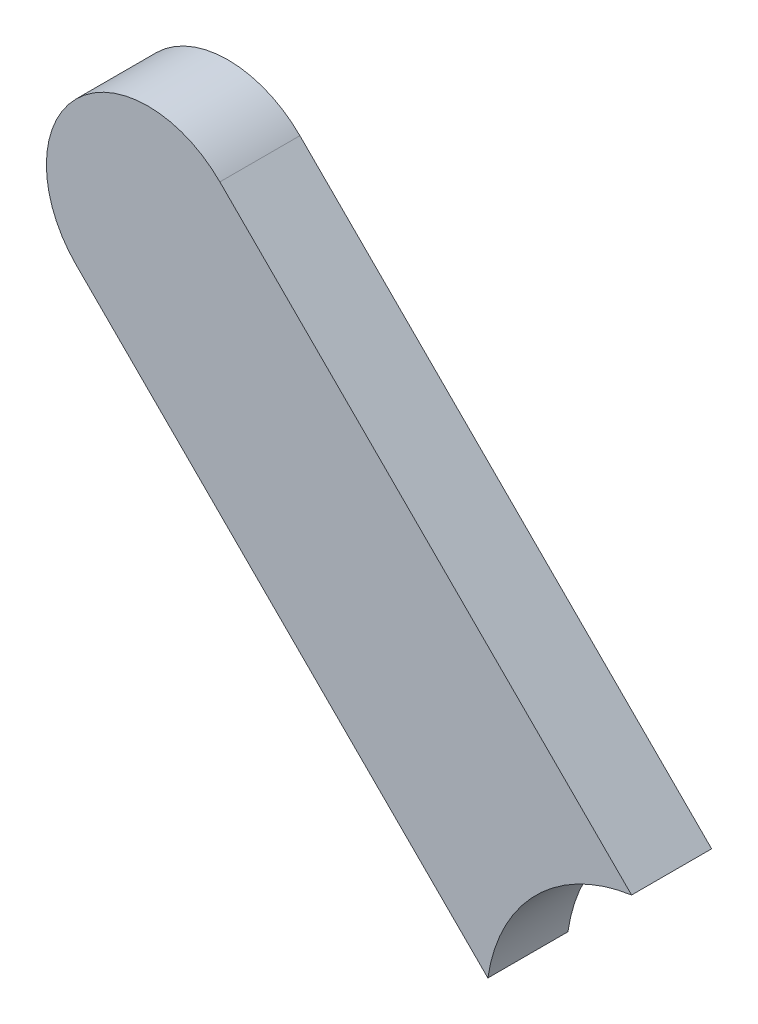
ISO-10303-21;
HEADER;
FILE_DESCRIPTION(('STEP AP214'),'2;1');
FILE_NAME('part.step','',(''),(''),'','','');
FILE_SCHEMA(('AUTOMOTIVE_DESIGN { 1 0 10303 214 1 1 1 1 }'));
ENDSEC;
DATA;
#1=APPLICATION_CONTEXT('core data for automotive mechanical design processes');
#2=APPLICATION_PROTOCOL_DEFINITION('international standard','automotive_design',2000,#1);
#3=PRODUCT_CONTEXT('',#1,'mechanical');
#4=PRODUCT('Part','Part','',(#3));
#5=PRODUCT_RELATED_PRODUCT_CATEGORY('part','',(#4));
#6=PRODUCT_DEFINITION_FORMATION('','',#4);
#7=PRODUCT_DEFINITION_CONTEXT('part definition',#1,'design');
#8=PRODUCT_DEFINITION('design','',#6,#7);
#9=PRODUCT_DEFINITION_SHAPE('','',#8);
#10=(LENGTH_UNIT() NAMED_UNIT(*) SI_UNIT(.MILLI.,.METRE.));
#11=(NAMED_UNIT(*) PLANE_ANGLE_UNIT() SI_UNIT($,.RADIAN.));
#12=(NAMED_UNIT(*) SI_UNIT($,.STERADIAN.) SOLID_ANGLE_UNIT());
#13=UNCERTAINTY_MEASURE_WITH_UNIT(LENGTH_MEASURE(1.E-05),#10,'distance_accuracy_value','');
#14=(GEOMETRIC_REPRESENTATION_CONTEXT(3) GLOBAL_UNCERTAINTY_ASSIGNED_CONTEXT((#13)) GLOBAL_UNIT_ASSIGNED_CONTEXT((#10,
#11,#12)) REPRESENTATION_CONTEXT('',''));
#15=CARTESIAN_POINT('',(0.,0.,0.));
#16=DIRECTION('',(0.,0.,1.));
#17=DIRECTION('',(1.,0.,0.));
#18=AXIS2_PLACEMENT_3D('',#15,#16,#17);
#19=CARTESIAN_POINT('',(148.9183966,116.15239406,0.));
#20=DIRECTION('',(0.707106781186548,0.707106781186548,0.));
#21=DIRECTION('',(0.707106781186548,-0.707106781186548,0.));
#22=AXIS2_PLACEMENT_3D('',#19,#20,#21);
#23=PLANE('',#22);
#24=DIRECTION('',(0.707106781186548,-0.707106781186548,0.));
#25=VECTOR('',#24,1.);
#26=CARTESIAN_POINT('',(148.9183966,116.15239406,0.1999996));
#27=LINE('',#26,#25);
#28=CARTESIAN_POINT('',(148.9183966,116.15239406,0.1999996));
#29=VERTEX_POINT('',#28);
#30=CARTESIAN_POINT('',(149.947449607867,115.123341052133,0.1999996));
#31=VERTEX_POINT('',#30);
#32=EDGE_CURVE('E11',#29,#31,#27,.T.);
#33=ORIENTED_EDGE('',*,*,#32,.F.);
#34=DIRECTION('',(0.,0.,1.));
#35=VECTOR('',#34,1.);
#36=CARTESIAN_POINT('',(148.9183966,116.15239406,0.));
#37=LINE('',#36,#35);
#38=CARTESIAN_POINT('',(148.9183966,116.15239406,0.));
#39=VERTEX_POINT('',#38);
#40=EDGE_CURVE('E24',#39,#29,#37,.T.);
#41=ORIENTED_EDGE('',*,*,#40,.F.);
#42=DIRECTION('',(0.707106781186548,-0.707106781186548,0.));
#43=VECTOR('',#42,1.);
#44=CARTESIAN_POINT('',(148.9183966,116.15239406,0.));
#45=LINE('',#44,#43);
#46=CARTESIAN_POINT('',(149.947449607867,115.123341052133,0.));
#47=VERTEX_POINT('',#46);
#48=EDGE_CURVE('E75',#39,#47,#45,.T.);
#49=ORIENTED_EDGE('',*,*,#48,.T.);
#50=DIRECTION('',(0.,0.,1.));
#51=VECTOR('',#50,1.);
#52=CARTESIAN_POINT('',(149.947449607867,115.123341052133,0.));
#53=LINE('',#52,#51);
#54=EDGE_CURVE('E37',#47,#31,#53,.T.);
#55=ORIENTED_EDGE('',*,*,#54,.T.);
#56=EDGE_LOOP('',(#33,#41,#49,#55));
#57=FACE_BOUND('',#56,.T.);
#58=ADVANCED_FACE('F17',(#57),#23,.F.);
#59=CARTESIAN_POINT('',(150.368,115.062,0.));
#60=DIRECTION('',(0.,0.,-1.));
#61=DIRECTION('',(1.,0.,0.));
#62=AXIS2_PLACEMENT_3D('',#59,#60,#61);
#63=CYLINDRICAL_SURFACE('',#62,0.42500042);
#64=DIRECTION('',(0.,0.,1.));
#65=VECTOR('',#64,1.);
#66=CARTESIAN_POINT('',(150.306658947867,115.482550392133,0.));
#67=LINE('',#66,#65);
#68=CARTESIAN_POINT('',(150.306658947867,115.482550392133,0.));
#69=VERTEX_POINT('',#68);
#70=CARTESIAN_POINT('',(150.306658947867,115.482550392133,0.1999996));
#71=VERTEX_POINT('',#70);
#72=EDGE_CURVE('E67',#69,#71,#67,.T.);
#73=ORIENTED_EDGE('',*,*,#72,.T.);
#74=CARTESIAN_POINT('',(150.368,115.062,0.1999996));
#75=DIRECTION('',(0.,0.,1.));
#76=DIRECTION('',(1.,0.,0.));
#77=AXIS2_PLACEMENT_3D('',#74,#75,#76);
#78=CIRCLE('',#77,0.42500042);
#79=EDGE_CURVE('E82',#71,#31,#78,.T.);
#80=ORIENTED_EDGE('',*,*,#79,.T.);
#81=ORIENTED_EDGE('',*,*,#54,.F.);
#82=CARTESIAN_POINT('',(150.368,115.062,0.));
#83=DIRECTION('',(0.,0.,1.));
#84=DIRECTION('',(1.,0.,0.));
#85=AXIS2_PLACEMENT_3D('',#82,#83,#84);
#86=CIRCLE('',#85,0.42500042);
#87=EDGE_CURVE('E80',#69,#47,#86,.T.);
#88=ORIENTED_EDGE('',*,*,#87,.F.);
#89=EDGE_LOOP('',(#73,#80,#81,#88));
#90=FACE_BOUND('',#89,.T.);
#91=ADVANCED_FACE('F88',(#90),#63,.F.);
#92=CARTESIAN_POINT('',(150.306658947867,115.482550392133,0.));
#93=DIRECTION('',(-0.707106781186556,-0.70710678118654,0.));
#94=DIRECTION('',(-0.70710678118654,0.707106781186556,0.));
#95=AXIS2_PLACEMENT_3D('',#92,#93,#94);
#96=PLANE('',#95);
#97=DIRECTION('',(-0.70710678118654,0.707106781186556,0.));
#98=VECTOR('',#97,1.);
#99=CARTESIAN_POINT('',(150.5476034,115.24160594,0.1999996));
#100=LINE('',#99,#98);
#101=CARTESIAN_POINT('',(149.27760594,116.5116034,0.1999996));
#102=VERTEX_POINT('',#101);
#103=EDGE_CURVE('E71',#71,#102,#100,.T.);
#104=ORIENTED_EDGE('',*,*,#103,.F.);
#105=ORIENTED_EDGE('',*,*,#72,.F.);
#106=DIRECTION('',(-0.70710678118654,0.707106781186556,0.));
#107=VECTOR('',#106,1.);
#108=CARTESIAN_POINT('',(150.5476034,115.24160594,0.));
#109=LINE('',#108,#107);
#110=CARTESIAN_POINT('',(149.27760594,116.5116034,0.));
#111=VERTEX_POINT('',#110);
#112=EDGE_CURVE('E63',#69,#111,#109,.T.);
#113=ORIENTED_EDGE('',*,*,#112,.T.);
#114=DIRECTION('',(0.,0.,1.));
#115=VECTOR('',#114,1.);
#116=CARTESIAN_POINT('',(149.27760594,116.5116034,0.));
#117=LINE('',#116,#115);
#118=EDGE_CURVE('E53',#111,#102,#117,.T.);
#119=ORIENTED_EDGE('',*,*,#118,.T.);
#120=EDGE_LOOP('',(#104,#105,#113,#119));
#121=FACE_BOUND('',#120,.T.);
#122=ADVANCED_FACE('F66',(#121),#96,.F.);
#123=CARTESIAN_POINT('',(149.09800127,116.33199873,0.));
#124=DIRECTION('',(0.,0.,-1.));
#125=DIRECTION('',(0.707106781186548,0.707106781186548,0.));
#126=AXIS2_PLACEMENT_3D('',#123,#124,#125);
#127=CYLINDRICAL_SURFACE('',#126,0.253999360179549);
#128=CARTESIAN_POINT('',(149.09800127,116.33199873,0.1999996));
#129=DIRECTION('',(0.,0.,1.));
#130=DIRECTION('',(0.707106781186548,0.707106781186548,0.));
#131=AXIS2_PLACEMENT_3D('',#128,#129,#130);
#132=CIRCLE('',#131,0.253999360179549);
#133=EDGE_CURVE('E59',#102,#29,#132,.T.);
#134=ORIENTED_EDGE('',*,*,#133,.F.);
#135=ORIENTED_EDGE('',*,*,#118,.F.);
#136=CARTESIAN_POINT('',(149.09800127,116.33199873,0.));
#137=DIRECTION('',(0.,0.,1.));
#138=DIRECTION('',(0.707106781186548,0.707106781186548,0.));
#139=AXIS2_PLACEMENT_3D('',#136,#137,#138);
#140=CIRCLE('',#139,0.253999360179549);
#141=EDGE_CURVE('E57',#111,#39,#140,.T.);
#142=ORIENTED_EDGE('',*,*,#141,.T.);
#143=ORIENTED_EDGE('',*,*,#40,.T.);
#144=EDGE_LOOP('',(#134,#135,#142,#143));
#145=FACE_BOUND('',#144,.T.);
#146=ADVANCED_FACE('F55',(#145),#127,.T.);
#147=CARTESIAN_POINT('',(148.9183966,116.15239406,0.));
#148=DIRECTION('',(0.,0.,-1.));
#149=DIRECTION('',(-1.,0.,0.));
#150=AXIS2_PLACEMENT_3D('',#147,#148,#149);
#151=PLANE('',#150);
#152=ORIENTED_EDGE('',*,*,#48,.F.);
#153=ORIENTED_EDGE('',*,*,#141,.F.);
#154=ORIENTED_EDGE('',*,*,#112,.F.);
#155=ORIENTED_EDGE('',*,*,#87,.T.);
#156=EDGE_LOOP('',(#152,#153,#154,#155));
#157=FACE_BOUND('',#156,.T.);
#158=ADVANCED_FACE('F74',(#157),#151,.T.);
#159=CARTESIAN_POINT('',(148.9183966,116.15239406,0.1999996));
#160=DIRECTION('',(0.,0.,-1.));
#161=DIRECTION('',(-1.,0.,0.));
#162=AXIS2_PLACEMENT_3D('',#159,#160,#161);
#163=PLANE('',#162);
#164=ORIENTED_EDGE('',*,*,#133,.T.);
#165=ORIENTED_EDGE('',*,*,#32,.T.);
#166=ORIENTED_EDGE('',*,*,#79,.F.);
#167=ORIENTED_EDGE('',*,*,#103,.T.);
#168=EDGE_LOOP('',(#164,#165,#166,#167));
#169=FACE_BOUND('',#168,.T.);
#170=ADVANCED_FACE('F91',(#169),#163,.F.);
#171=CLOSED_SHELL('',(#58,#91,#122,#146,#158,#170));
#172=MANIFOLD_SOLID_BREP('B1',#171);
#173=ADVANCED_BREP_SHAPE_REPRESENTATION('',(#18,#172),#14);
#174=SHAPE_DEFINITION_REPRESENTATION(#9,#173);
ENDSEC;
END-ISO-10303-21;
